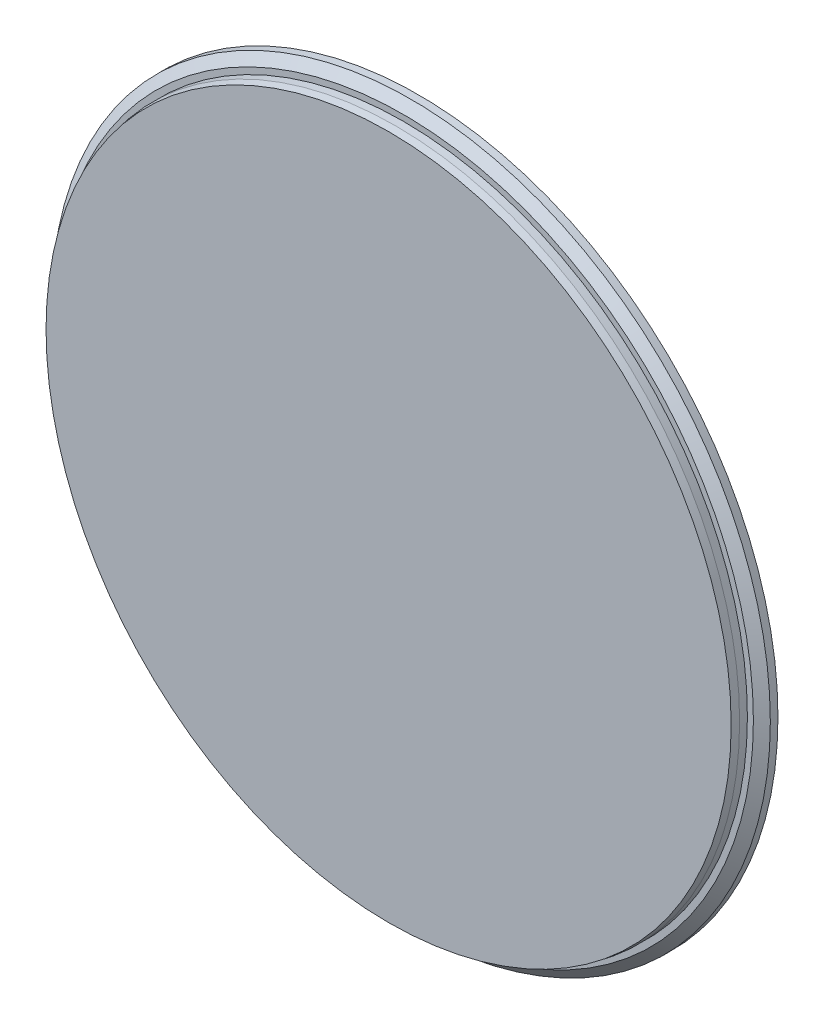
ISO-10303-21;
HEADER;
FILE_DESCRIPTION(('STEP AP214'),'2;1');
FILE_NAME('part.step','',(''),(''),'','','');
FILE_SCHEMA(('AUTOMOTIVE_DESIGN { 1 0 10303 214 1 1 1 1 }'));
ENDSEC;
DATA;
#1=APPLICATION_CONTEXT('core data for automotive mechanical design processes');
#2=APPLICATION_PROTOCOL_DEFINITION('international standard','automotive_design',2000,#1);
#3=PRODUCT_CONTEXT('',#1,'mechanical');
#4=PRODUCT('Part','Part','',(#3));
#5=PRODUCT_RELATED_PRODUCT_CATEGORY('part','',(#4));
#6=PRODUCT_DEFINITION_FORMATION('','',#4);
#7=PRODUCT_DEFINITION_CONTEXT('part definition',#1,'design');
#8=PRODUCT_DEFINITION('design','',#6,#7);
#9=PRODUCT_DEFINITION_SHAPE('','',#8);
#10=(LENGTH_UNIT() NAMED_UNIT(*) SI_UNIT(.MILLI.,.METRE.));
#11=(NAMED_UNIT(*) PLANE_ANGLE_UNIT() SI_UNIT($,.RADIAN.));
#12=(NAMED_UNIT(*) SI_UNIT($,.STERADIAN.) SOLID_ANGLE_UNIT());
#13=UNCERTAINTY_MEASURE_WITH_UNIT(LENGTH_MEASURE(1.E-05),#10,'distance_accuracy_value','');
#14=(GEOMETRIC_REPRESENTATION_CONTEXT(3) GLOBAL_UNCERTAINTY_ASSIGNED_CONTEXT((#13)) GLOBAL_UNIT_ASSIGNED_CONTEXT((#10,
#11,#12)) REPRESENTATION_CONTEXT('',''));
#15=CARTESIAN_POINT('',(0.,0.,0.));
#16=DIRECTION('',(0.,0.,1.));
#17=DIRECTION('',(1.,0.,0.));
#18=AXIS2_PLACEMENT_3D('',#15,#16,#17);
#19=CARTESIAN_POINT('',(0.,0.,0.));
#20=DIRECTION('',(0.,0.,-1.));
#21=DIRECTION('',(-1.,0.,0.));
#22=AXIS2_PLACEMENT_3D('',#19,#20,#21);
#23=PLANE('',#22);
#24=CARTESIAN_POINT('',(0.,0.,0.));
#25=DIRECTION('',(0.,0.,1.));
#26=DIRECTION('',(1.,0.,0.));
#27=AXIS2_PLACEMENT_3D('',#24,#25,#26);
#28=CIRCLE('',#27,36.3146388407002);
#29=CARTESIAN_POINT('',(36.3146388407002,0.,0.));
#30=VERTEX_POINT('',#29);
#31=EDGE_CURVE('E10',#30,#30,#28,.T.);
#32=ORIENTED_EDGE('',*,*,#31,.T.);
#33=EDGE_LOOP('',(#32));
#34=FACE_BOUND('',#33,.T.);
#35=ADVANCED_FACE('F31',(#34),#23,.F.);
#36=CARTESIAN_POINT('',(0.,0.,-0.761999999999992));
#37=DIRECTION('',(0.,0.,-1.));
#38=DIRECTION('',(-1.,0.,0.));
#39=AXIS2_PLACEMENT_3D('',#36,#37,#38);
#40=CONICAL_SURFACE('',#39,36.449,0.174532925199424);
#41=ORIENTED_EDGE('',*,*,#31,.F.);
#42=EDGE_LOOP('',(#41));
#43=FACE_BOUND('',#42,.T.);
#44=CARTESIAN_POINT('',(0.,0.,-0.761999999999992));
#45=DIRECTION('',(0.,0.,1.));
#46=DIRECTION('',(1.,0.,0.));
#47=AXIS2_PLACEMENT_3D('',#44,#45,#46);
#48=CIRCLE('',#47,36.449);
#49=CARTESIAN_POINT('',(36.449,0.,-0.761999999999992));
#50=VERTEX_POINT('',#49);
#51=EDGE_CURVE('E37',#50,#50,#48,.T.);
#52=ORIENTED_EDGE('',*,*,#51,.T.);
#53=EDGE_LOOP('',(#52));
#54=FACE_BOUND('',#53,.T.);
#55=ADVANCED_FACE('F69',(#43,#54),#40,.T.);
#56=CARTESIAN_POINT('',(0.,0.,7.98918365547595));
#57=DIRECTION('',(0.,0.,1.));
#58=DIRECTION('',(1.,0.,0.));
#59=AXIS2_PLACEMENT_3D('',#56,#57,#58);
#60=CYLINDRICAL_SURFACE('',#59,36.449);
#61=ORIENTED_EDGE('',*,*,#51,.F.);
#62=EDGE_LOOP('',(#61));
#63=FACE_BOUND('',#62,.T.);
#64=CARTESIAN_POINT('',(0.,0.,-1.58749999999999));
#65=DIRECTION('',(0.,0.,1.));
#66=DIRECTION('',(1.,0.,0.));
#67=AXIS2_PLACEMENT_3D('',#64,#65,#66);
#68=CIRCLE('',#67,36.449);
#69=CARTESIAN_POINT('',(36.449,0.,-1.58749999999999));
#70=VERTEX_POINT('',#69);
#71=EDGE_CURVE('E41',#70,#70,#68,.T.);
#72=ORIENTED_EDGE('',*,*,#71,.T.);
#73=EDGE_LOOP('',(#72));
#74=FACE_BOUND('',#73,.T.);
#75=ADVANCED_FACE('F73',(#63,#74),#60,.T.);
#76=CARTESIAN_POINT('',(0.,36.449,-1.58749999999999));
#77=DIRECTION('',(0.,0.,-1.));
#78=DIRECTION('',(-1.,0.,0.));
#79=AXIS2_PLACEMENT_3D('',#76,#77,#78);
#80=PLANE('',#79);
#81=ORIENTED_EDGE('',*,*,#71,.F.);
#82=EDGE_LOOP('',(#81));
#83=FACE_BOUND('',#82,.T.);
#84=CARTESIAN_POINT('',(0.,0.,-1.58749999999999));
#85=DIRECTION('',(0.,0.,1.));
#86=DIRECTION('',(1.,0.,0.));
#87=AXIS2_PLACEMENT_3D('',#84,#85,#86);
#88=CIRCLE('',#87,37.084);
#89=CARTESIAN_POINT('',(37.084,0.,-1.58749999999999));
#90=VERTEX_POINT('',#89);
#91=EDGE_CURVE('E45',#90,#90,#88,.T.);
#92=ORIENTED_EDGE('',*,*,#91,.T.);
#93=EDGE_LOOP('',(#92));
#94=FACE_BOUND('',#93,.T.);
#95=ADVANCED_FACE('F78',(#83,#94),#80,.F.);
#96=CARTESIAN_POINT('',(0.,0.,-2.36710421978662));
#97=DIRECTION('',(0.,0.,-1.));
#98=DIRECTION('',(-1.,0.,0.));
#99=AXIS2_PLACEMENT_3D('',#96,#97,#98);
#100=CONICAL_SURFACE('',#99,38.1,0.916297857297021);
#101=ORIENTED_EDGE('',*,*,#91,.F.);
#102=EDGE_LOOP('',(#101));
#103=FACE_BOUND('',#102,.T.);
#104=CARTESIAN_POINT('',(0.,0.,-2.36710421978662));
#105=DIRECTION('',(0.,0.,1.));
#106=DIRECTION('',(1.,0.,0.));
#107=AXIS2_PLACEMENT_3D('',#104,#105,#106);
#108=CIRCLE('',#107,38.1);
#109=CARTESIAN_POINT('',(38.1,0.,-2.36710421978662));
#110=VERTEX_POINT('',#109);
#111=EDGE_CURVE('E50',#110,#110,#108,.T.);
#112=ORIENTED_EDGE('',*,*,#111,.T.);
#113=EDGE_LOOP('',(#112));
#114=FACE_BOUND('',#113,.T.);
#115=ADVANCED_FACE('F65',(#103,#114),#100,.T.);
#116=CARTESIAN_POINT('',(0.,0.,7.98918365547595));
#117=DIRECTION('',(0.,0.,1.));
#118=DIRECTION('',(1.,0.,0.));
#119=AXIS2_PLACEMENT_3D('',#116,#117,#118);
#120=CYLINDRICAL_SURFACE('',#119,38.1);
#121=ORIENTED_EDGE('',*,*,#111,.F.);
#122=EDGE_LOOP('',(#121));
#123=FACE_BOUND('',#122,.T.);
#124=CARTESIAN_POINT('',(0.,0.,-3.17499999999999));
#125=DIRECTION('',(0.,0.,1.));
#126=DIRECTION('',(1.,0.,0.));
#127=AXIS2_PLACEMENT_3D('',#124,#125,#126);
#128=CIRCLE('',#127,38.1);
#129=CARTESIAN_POINT('',(38.1,0.,-3.17499999999999));
#130=VERTEX_POINT('',#129);
#131=EDGE_CURVE('E53',#130,#130,#128,.T.);
#132=ORIENTED_EDGE('',*,*,#131,.T.);
#133=EDGE_LOOP('',(#132));
#134=FACE_BOUND('',#133,.T.);
#135=ADVANCED_FACE('F57',(#123,#134),#120,.T.);
#136=CARTESIAN_POINT('',(0.,38.1,-3.17499999999999));
#137=DIRECTION('',(0.,0.,1.));
#138=DIRECTION('',(1.,0.,0.));
#139=AXIS2_PLACEMENT_3D('',#136,#137,#138);
#140=PLANE('',#139);
#141=ORIENTED_EDGE('',*,*,#131,.F.);
#142=EDGE_LOOP('',(#141));
#143=FACE_BOUND('',#142,.T.);
#144=ADVANCED_FACE('F59',(#143),#140,.F.);
#145=CLOSED_SHELL('',(#35,#55,#75,#95,#115,#135,#144));
#146=MANIFOLD_SOLID_BREP('B2',#145);
#147=ADVANCED_BREP_SHAPE_REPRESENTATION('',(#18,#146),#14);
#148=SHAPE_DEFINITION_REPRESENTATION(#9,#147);
ENDSEC;
END-ISO-10303-21;
